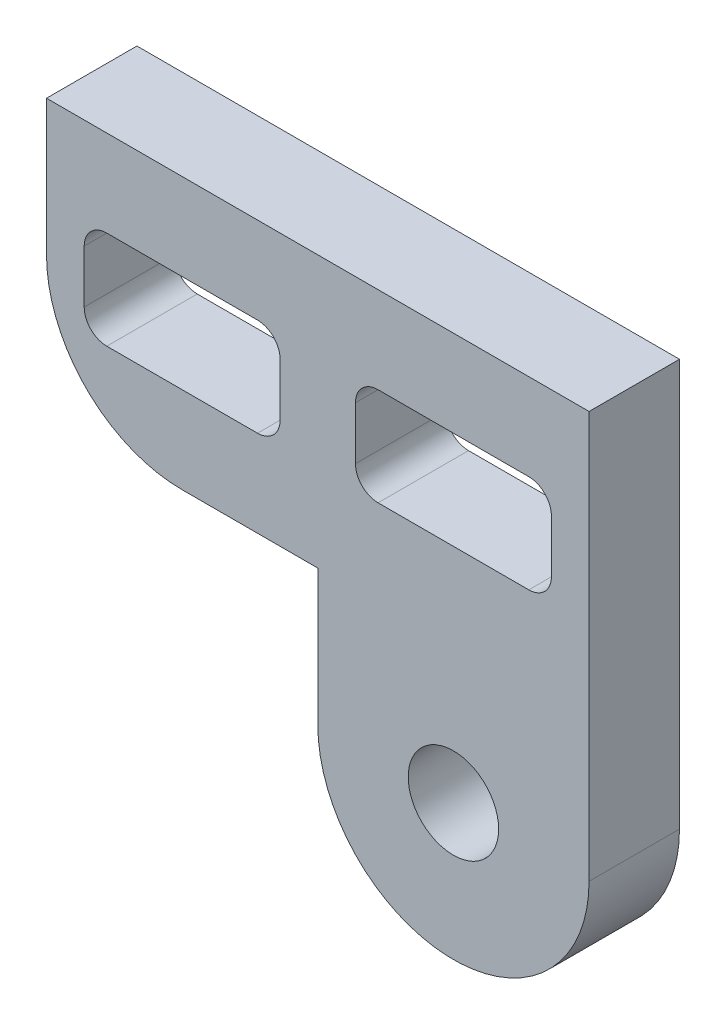
ISO-10303-21;
HEADER;
FILE_DESCRIPTION(('STEP AP214'),'2;1');
FILE_NAME('part.step','',(''),(''),'','','');
FILE_SCHEMA(('AUTOMOTIVE_DESIGN { 1 0 10303 214 1 1 1 1 }'));
ENDSEC;
DATA;
#1=APPLICATION_CONTEXT('core data for automotive mechanical design processes');
#2=APPLICATION_PROTOCOL_DEFINITION('international standard','automotive_design',2000,#1);
#3=PRODUCT_CONTEXT('',#1,'mechanical');
#4=PRODUCT('Part','Part','',(#3));
#5=PRODUCT_RELATED_PRODUCT_CATEGORY('part','',(#4));
#6=PRODUCT_DEFINITION_FORMATION('','',#4);
#7=PRODUCT_DEFINITION_CONTEXT('part definition',#1,'design');
#8=PRODUCT_DEFINITION('design','',#6,#7);
#9=PRODUCT_DEFINITION_SHAPE('','',#8);
#10=(LENGTH_UNIT() NAMED_UNIT(*) SI_UNIT(.MILLI.,.METRE.));
#11=(NAMED_UNIT(*) PLANE_ANGLE_UNIT() SI_UNIT($,.RADIAN.));
#12=(NAMED_UNIT(*) SI_UNIT($,.STERADIAN.) SOLID_ANGLE_UNIT());
#13=UNCERTAINTY_MEASURE_WITH_UNIT(LENGTH_MEASURE(1.E-05),#10,'distance_accuracy_value','');
#14=(GEOMETRIC_REPRESENTATION_CONTEXT(3) GLOBAL_UNCERTAINTY_ASSIGNED_CONTEXT((#13)) GLOBAL_UNIT_ASSIGNED_CONTEXT((#10,
#11,#12)) REPRESENTATION_CONTEXT('',''));
#15=CARTESIAN_POINT('',(0.,0.,0.));
#16=DIRECTION('',(0.,0.,1.));
#17=DIRECTION('',(1.,0.,0.));
#18=AXIS2_PLACEMENT_3D('',#15,#16,#17);
#19=CARTESIAN_POINT('',(149.3421335095,207.323953209,3.));
#20=DIRECTION('',(0.,0.,1.));
#21=DIRECTION('',(1.,0.,0.));
#22=AXIS2_PLACEMENT_3D('',#19,#20,#21);
#23=PLANE('',#22);
#24=DIRECTION('',(1.,0.,0.));
#25=VECTOR('',#24,1.);
#26=CARTESIAN_POINT('',(160.8421335095,205.698953209,3.));
#27=LINE('',#26,#25);
#28=CARTESIAN_POINT('',(155.8421335095,205.698953209,3.));
#29=VERTEX_POINT('',#28);
#30=CARTESIAN_POINT('',(160.8421335095,205.698953209,3.));
#31=VERTEX_POINT('',#30);
#32=EDGE_CURVE('E196',#29,#31,#27,.T.);
#33=ORIENTED_EDGE('',*,*,#32,.F.);
#34=CARTESIAN_POINT('',(155.8421335095,206.448953209,3.));
#35=DIRECTION('',(0.,0.,1.));
#36=DIRECTION('',(1.,0.,0.));
#37=AXIS2_PLACEMENT_3D('',#34,#35,#36);
#38=CIRCLE('',#37,0.749999999999987);
#39=CARTESIAN_POINT('',(155.0921335095,206.448953209,3.));
#40=VERTEX_POINT('',#39);
#41=EDGE_CURVE('E188',#40,#29,#38,.T.);
#42=ORIENTED_EDGE('',*,*,#41,.F.);
#43=DIRECTION('',(0.,-1.,0.));
#44=VECTOR('',#43,1.);
#45=CARTESIAN_POINT('',(155.0921335095,206.448953209,3.));
#46=LINE('',#45,#44);
#47=CARTESIAN_POINT('',(155.0921335095,208.198953209,3.));
#48=VERTEX_POINT('',#47);
#49=EDGE_CURVE('E223',#48,#40,#46,.T.);
#50=ORIENTED_EDGE('',*,*,#49,.F.);
#51=CARTESIAN_POINT('',(155.8421335095,208.198953209,3.));
#52=DIRECTION('',(0.,0.,1.));
#53=DIRECTION('',(1.,0.,0.));
#54=AXIS2_PLACEMENT_3D('',#51,#52,#53);
#55=CIRCLE('',#54,0.749999999999987);
#56=CARTESIAN_POINT('',(155.8421335095,208.948953209,3.));
#57=VERTEX_POINT('',#56);
#58=EDGE_CURVE('E221',#57,#48,#55,.T.);
#59=ORIENTED_EDGE('',*,*,#58,.F.);
#60=DIRECTION('',(-1.,0.,0.));
#61=VECTOR('',#60,1.);
#62=CARTESIAN_POINT('',(155.8421335095,208.948953209,3.));
#63=LINE('',#62,#61);
#64=CARTESIAN_POINT('',(160.8421335095,208.948953209,3.));
#65=VERTEX_POINT('',#64);
#66=EDGE_CURVE('E219',#65,#57,#63,.T.);
#67=ORIENTED_EDGE('',*,*,#66,.F.);
#68=CARTESIAN_POINT('',(160.8421335095,208.198953209,3.));
#69=DIRECTION('',(0.,0.,1.));
#70=DIRECTION('',(1.,0.,0.));
#71=AXIS2_PLACEMENT_3D('',#68,#69,#70);
#72=CIRCLE('',#71,0.750000000000001);
#73=CARTESIAN_POINT('',(161.5921335095,208.198953209,3.));
#74=VERTEX_POINT('',#73);
#75=EDGE_CURVE('E217',#74,#65,#72,.T.);
#76=ORIENTED_EDGE('',*,*,#75,.F.);
#77=DIRECTION('',(0.,1.,0.));
#78=VECTOR('',#77,1.);
#79=CARTESIAN_POINT('',(161.5921335095,208.198953209,3.));
#80=LINE('',#79,#78);
#81=CARTESIAN_POINT('',(161.5921335095,206.448953209,3.));
#82=VERTEX_POINT('',#81);
#83=EDGE_CURVE('E212',#82,#74,#80,.T.);
#84=ORIENTED_EDGE('',*,*,#83,.F.);
#85=CARTESIAN_POINT('',(160.8421335095,206.448953209,3.));
#86=DIRECTION('',(0.,0.,1.));
#87=DIRECTION('',(1.,0.,0.));
#88=AXIS2_PLACEMENT_3D('',#85,#86,#87);
#89=CIRCLE('',#88,0.750000000000001);
#90=EDGE_CURVE('E210',#31,#82,#89,.T.);
#91=ORIENTED_EDGE('',*,*,#90,.F.);
#92=EDGE_LOOP('',(#33,#42,#50,#59,#67,#76,#84,#91));
#93=FACE_BOUND('',#92,.T.);
#94=CARTESIAN_POINT('',(149.3421335095,207.323953209,3.));
#95=DIRECTION('',(0.,0.,1.));
#96=DIRECTION('',(1.,0.,0.));
#97=AXIS2_PLACEMENT_3D('',#94,#95,#96);
#98=CIRCLE('',#97,4.49999999999999);
#99=CARTESIAN_POINT('',(144.8421335095,207.323953209,3.));
#100=VERTEX_POINT('',#99);
#101=CARTESIAN_POINT('',(149.3421335095,202.823953209,3.));
#102=VERTEX_POINT('',#101);
#103=EDGE_CURVE('E315',#100,#102,#98,.T.);
#104=ORIENTED_EDGE('',*,*,#103,.T.);
#105=DIRECTION('',(1.,0.,0.));
#106=VECTOR('',#105,1.);
#107=CARTESIAN_POINT('',(153.8421335095,202.823953209,3.));
#108=LINE('',#107,#106);
#109=CARTESIAN_POINT('',(153.8421335095,202.823953209,3.));
#110=VERTEX_POINT('',#109);
#111=EDGE_CURVE('E318',#102,#110,#108,.T.);
#112=ORIENTED_EDGE('',*,*,#111,.T.);
#113=DIRECTION('',(0.,-1.,0.));
#114=VECTOR('',#113,1.);
#115=CARTESIAN_POINT('',(153.8421335095,198.323953209,3.));
#116=LINE('',#115,#114);
#117=CARTESIAN_POINT('',(153.8421335095,198.323953209,3.));
#118=VERTEX_POINT('',#117);
#119=EDGE_CURVE('E321',#110,#118,#116,.T.);
#120=ORIENTED_EDGE('',*,*,#119,.T.);
#121=CARTESIAN_POINT('',(158.3421335095,198.323953209,3.));
#122=DIRECTION('',(0.,0.,1.));
#123=DIRECTION('',(1.,0.,0.));
#124=AXIS2_PLACEMENT_3D('',#121,#122,#123);
#125=CIRCLE('',#124,4.49999999999999);
#126=CARTESIAN_POINT('',(162.8421335095,198.323953209,3.));
#127=VERTEX_POINT('',#126);
#128=EDGE_CURVE('E323',#118,#127,#125,.T.);
#129=ORIENTED_EDGE('',*,*,#128,.T.);
#130=DIRECTION('',(0.,1.,0.));
#131=VECTOR('',#130,1.);
#132=CARTESIAN_POINT('',(162.8421335095,198.323953209,3.));
#133=LINE('',#132,#131);
#134=CARTESIAN_POINT('',(162.8421335095,211.823953209,3.));
#135=VERTEX_POINT('',#134);
#136=EDGE_CURVE('E325',#127,#135,#133,.T.);
#137=ORIENTED_EDGE('',*,*,#136,.T.);
#138=DIRECTION('',(-1.,0.,0.));
#139=VECTOR('',#138,1.);
#140=CARTESIAN_POINT('',(158.3421335095,211.823953209,3.));
#141=LINE('',#140,#139);
#142=CARTESIAN_POINT('',(144.8421335095,211.823953209,3.));
#143=VERTEX_POINT('',#142);
#144=EDGE_CURVE('E327',#135,#143,#141,.T.);
#145=ORIENTED_EDGE('',*,*,#144,.T.);
#146=DIRECTION('',(0.,-1.,0.));
#147=VECTOR('',#146,1.);
#148=CARTESIAN_POINT('',(144.8421335095,207.323953209,3.));
#149=LINE('',#148,#147);
#150=EDGE_CURVE('E329',#143,#100,#149,.T.);
#151=ORIENTED_EDGE('',*,*,#150,.T.);
#152=EDGE_LOOP('',(#104,#112,#120,#129,#137,#145,#151));
#153=FACE_BOUND('',#152,.T.);
#154=DIRECTION('',(1.,0.,0.));
#155=VECTOR('',#154,1.);
#156=CARTESIAN_POINT('',(151.8421335095,205.698953209,3.));
#157=LINE('',#156,#155);
#158=CARTESIAN_POINT('',(146.8421335095,205.698953209,3.));
#159=VERTEX_POINT('',#158);
#160=CARTESIAN_POINT('',(151.8421335095,205.698953209,3.));
#161=VERTEX_POINT('',#160);
#162=EDGE_CURVE('E258',#159,#161,#157,.T.);
#163=ORIENTED_EDGE('',*,*,#162,.F.);
#164=CARTESIAN_POINT('',(146.8421335095,206.448953209,3.));
#165=DIRECTION('',(0.,0.,1.));
#166=DIRECTION('',(1.,0.,0.));
#167=AXIS2_PLACEMENT_3D('',#164,#165,#166);
#168=CIRCLE('',#167,0.750000000000001);
#169=CARTESIAN_POINT('',(146.0921335095,206.448953209,3.));
#170=VERTEX_POINT('',#169);
#171=EDGE_CURVE('E256',#170,#159,#168,.T.);
#172=ORIENTED_EDGE('',*,*,#171,.F.);
#173=DIRECTION('',(0.,-1.,0.));
#174=VECTOR('',#173,1.);
#175=CARTESIAN_POINT('',(146.0921335095,206.448953209,3.));
#176=LINE('',#175,#174);
#177=CARTESIAN_POINT('',(146.0921335095,208.198953209,3.));
#178=VERTEX_POINT('',#177);
#179=EDGE_CURVE('E272',#178,#170,#176,.T.);
#180=ORIENTED_EDGE('',*,*,#179,.F.);
#181=CARTESIAN_POINT('',(146.8421335095,208.198953209,3.));
#182=DIRECTION('',(0.,0.,1.));
#183=DIRECTION('',(1.,0.,0.));
#184=AXIS2_PLACEMENT_3D('',#181,#182,#183);
#185=CIRCLE('',#184,0.750000000000001);
#186=CARTESIAN_POINT('',(146.8421335095,208.948953209,3.));
#187=VERTEX_POINT('',#186);
#188=EDGE_CURVE('E269',#187,#178,#185,.T.);
#189=ORIENTED_EDGE('',*,*,#188,.F.);
#190=DIRECTION('',(-1.,0.,0.));
#191=VECTOR('',#190,1.);
#192=CARTESIAN_POINT('',(146.8421335095,208.948953209,3.));
#193=LINE('',#192,#191);
#194=CARTESIAN_POINT('',(151.8421335095,208.948953209,3.));
#195=VERTEX_POINT('',#194);
#196=EDGE_CURVE('E267',#195,#187,#193,.T.);
#197=ORIENTED_EDGE('',*,*,#196,.F.);
#198=CARTESIAN_POINT('',(151.8421335095,208.198953209,3.));
#199=DIRECTION('',(0.,0.,1.));
#200=DIRECTION('',(1.,0.,0.));
#201=AXIS2_PLACEMENT_3D('',#198,#199,#200);
#202=CIRCLE('',#201,0.750000000000001);
#203=CARTESIAN_POINT('',(152.5921335095,208.198953209,3.));
#204=VERTEX_POINT('',#203);
#205=EDGE_CURVE('E265',#204,#195,#202,.T.);
#206=ORIENTED_EDGE('',*,*,#205,.F.);
#207=DIRECTION('',(0.,1.,0.));
#208=VECTOR('',#207,1.);
#209=CARTESIAN_POINT('',(152.5921335095,208.198953209,3.));
#210=LINE('',#209,#208);
#211=CARTESIAN_POINT('',(152.5921335095,206.448953209,3.));
#212=VERTEX_POINT('',#211);
#213=EDGE_CURVE('E263',#212,#204,#210,.T.);
#214=ORIENTED_EDGE('',*,*,#213,.F.);
#215=CARTESIAN_POINT('',(151.8421335095,206.448953209,3.));
#216=DIRECTION('',(0.,0.,1.));
#217=DIRECTION('',(1.,0.,0.));
#218=AXIS2_PLACEMENT_3D('',#215,#216,#217);
#219=CIRCLE('',#218,0.750000000000001);
#220=EDGE_CURVE('E261',#161,#212,#219,.T.);
#221=ORIENTED_EDGE('',*,*,#220,.F.);
#222=EDGE_LOOP('',(#163,#172,#180,#189,#197,#206,#214,#221));
#223=FACE_BOUND('',#222,.T.);
#224=CARTESIAN_POINT('',(158.3421335095,198.323953209,3.));
#225=DIRECTION('',(0.,0.,1.));
#226=DIRECTION('',(1.,0.,0.));
#227=AXIS2_PLACEMENT_3D('',#224,#225,#226);
#228=CIRCLE('',#227,1.5);
#229=CARTESIAN_POINT('',(159.8421335095,198.323953209,3.));
#230=VERTEX_POINT('',#229);
#231=EDGE_CURVE('E226',#230,#230,#228,.T.);
#232=ORIENTED_EDGE('',*,*,#231,.F.);
#233=EDGE_LOOP('',(#232));
#234=FACE_BOUND('',#233,.T.);
#235=ADVANCED_FACE('F33',(#93,#153,#223,#234),#23,.T.);
#236=CARTESIAN_POINT('',(149.3421335095,207.323953209,0.));
#237=DIRECTION('',(0.,0.,1.));
#238=DIRECTION('',(1.,0.,0.));
#239=AXIS2_PLACEMENT_3D('',#236,#237,#238);
#240=PLANE('',#239);
#241=CARTESIAN_POINT('',(155.8421335095,206.448953209,0.));
#242=DIRECTION('',(0.,0.,1.));
#243=DIRECTION('',(1.,0.,0.));
#244=AXIS2_PLACEMENT_3D('',#241,#242,#243);
#245=CIRCLE('',#244,0.749999999999987);
#246=CARTESIAN_POINT('',(155.0921335095,206.448953209,0.));
#247=VERTEX_POINT('',#246);
#248=CARTESIAN_POINT('',(155.8421335095,205.698953209,0.));
#249=VERTEX_POINT('',#248);
#250=EDGE_CURVE('E56',#247,#249,#245,.T.);
#251=ORIENTED_EDGE('',*,*,#250,.T.);
#252=DIRECTION('',(1.,0.,0.));
#253=VECTOR('',#252,1.);
#254=CARTESIAN_POINT('',(160.8421335095,205.698953209,0.));
#255=LINE('',#254,#253);
#256=CARTESIAN_POINT('',(160.8421335095,205.698953209,0.));
#257=VERTEX_POINT('',#256);
#258=EDGE_CURVE('E203',#249,#257,#255,.T.);
#259=ORIENTED_EDGE('',*,*,#258,.T.);
#260=CARTESIAN_POINT('',(160.8421335095,206.448953209,0.));
#261=DIRECTION('',(0.,0.,1.));
#262=DIRECTION('',(1.,0.,0.));
#263=AXIS2_PLACEMENT_3D('',#260,#261,#262);
#264=CIRCLE('',#263,0.750000000000001);
#265=CARTESIAN_POINT('',(161.5921335095,206.448953209,0.));
#266=VERTEX_POINT('',#265);
#267=EDGE_CURVE('E228',#257,#266,#264,.T.);
#268=ORIENTED_EDGE('',*,*,#267,.T.);
#269=DIRECTION('',(0.,1.,0.));
#270=VECTOR('',#269,1.);
#271=CARTESIAN_POINT('',(161.5921335095,208.198953209,0.));
#272=LINE('',#271,#270);
#273=CARTESIAN_POINT('',(161.5921335095,208.198953209,0.));
#274=VERTEX_POINT('',#273);
#275=EDGE_CURVE('E231',#266,#274,#272,.T.);
#276=ORIENTED_EDGE('',*,*,#275,.T.);
#277=CARTESIAN_POINT('',(160.8421335095,208.198953209,0.));
#278=DIRECTION('',(0.,0.,1.));
#279=DIRECTION('',(1.,0.,0.));
#280=AXIS2_PLACEMENT_3D('',#277,#278,#279);
#281=CIRCLE('',#280,0.750000000000001);
#282=CARTESIAN_POINT('',(160.8421335095,208.948953209,0.));
#283=VERTEX_POINT('',#282);
#284=EDGE_CURVE('E234',#274,#283,#281,.T.);
#285=ORIENTED_EDGE('',*,*,#284,.T.);
#286=DIRECTION('',(-1.,0.,0.));
#287=VECTOR('',#286,1.);
#288=CARTESIAN_POINT('',(155.8421335095,208.948953209,0.));
#289=LINE('',#288,#287);
#290=CARTESIAN_POINT('',(155.8421335095,208.948953209,0.));
#291=VERTEX_POINT('',#290);
#292=EDGE_CURVE('E237',#283,#291,#289,.T.);
#293=ORIENTED_EDGE('',*,*,#292,.T.);
#294=CARTESIAN_POINT('',(155.8421335095,208.198953209,0.));
#295=DIRECTION('',(0.,0.,1.));
#296=DIRECTION('',(1.,0.,0.));
#297=AXIS2_PLACEMENT_3D('',#294,#295,#296);
#298=CIRCLE('',#297,0.749999999999987);
#299=CARTESIAN_POINT('',(155.0921335095,208.198953209,0.));
#300=VERTEX_POINT('',#299);
#301=EDGE_CURVE('E240',#291,#300,#298,.T.);
#302=ORIENTED_EDGE('',*,*,#301,.T.);
#303=DIRECTION('',(0.,-1.,0.));
#304=VECTOR('',#303,1.);
#305=CARTESIAN_POINT('',(155.0921335095,206.448953209,0.));
#306=LINE('',#305,#304);
#307=EDGE_CURVE('E197',#300,#247,#306,.T.);
#308=ORIENTED_EDGE('',*,*,#307,.T.);
#309=EDGE_LOOP('',(#251,#259,#268,#276,#285,#293,#302,#308));
#310=FACE_BOUND('',#309,.T.);
#311=CARTESIAN_POINT('',(149.3421335095,207.323953209,0.));
#312=DIRECTION('',(0.,0.,1.));
#313=DIRECTION('',(1.,0.,0.));
#314=AXIS2_PLACEMENT_3D('',#311,#312,#313);
#315=CIRCLE('',#314,4.49999999999999);
#316=CARTESIAN_POINT('',(144.8421335095,207.323953209,0.));
#317=VERTEX_POINT('',#316);
#318=CARTESIAN_POINT('',(149.3421335095,202.823953209,0.));
#319=VERTEX_POINT('',#318);
#320=EDGE_CURVE('E314',#317,#319,#315,.T.);
#321=ORIENTED_EDGE('',*,*,#320,.F.);
#322=DIRECTION('',(0.,-1.,0.));
#323=VECTOR('',#322,1.);
#324=CARTESIAN_POINT('',(144.8421335095,207.323953209,0.));
#325=LINE('',#324,#323);
#326=CARTESIAN_POINT('',(144.8421335095,211.823953209,0.));
#327=VERTEX_POINT('',#326);
#328=EDGE_CURVE('E319',#327,#317,#325,.T.);
#329=ORIENTED_EDGE('',*,*,#328,.F.);
#330=DIRECTION('',(-1.,0.,0.));
#331=VECTOR('',#330,1.);
#332=CARTESIAN_POINT('',(149.3421335095,211.823953209,0.));
#333=LINE('',#332,#331);
#334=CARTESIAN_POINT('',(162.8421335095,211.823953209,0.));
#335=VERTEX_POINT('',#334);
#336=EDGE_CURVE('E343',#335,#327,#333,.T.);
#337=ORIENTED_EDGE('',*,*,#336,.F.);
#338=DIRECTION('',(0.,1.,0.));
#339=VECTOR('',#338,1.);
#340=CARTESIAN_POINT('',(162.8421335095,198.323953209,0.));
#341=LINE('',#340,#339);
#342=CARTESIAN_POINT('',(162.8421335095,198.323953209,0.));
#343=VERTEX_POINT('',#342);
#344=EDGE_CURVE('E340',#343,#335,#341,.T.);
#345=ORIENTED_EDGE('',*,*,#344,.F.);
#346=CARTESIAN_POINT('',(158.3421335095,198.323953209,0.));
#347=DIRECTION('',(0.,0.,1.));
#348=DIRECTION('',(1.,0.,0.));
#349=AXIS2_PLACEMENT_3D('',#346,#347,#348);
#350=CIRCLE('',#349,4.49999999999999);
#351=CARTESIAN_POINT('',(153.8421335095,198.323953209,0.));
#352=VERTEX_POINT('',#351);
#353=EDGE_CURVE('E338',#352,#343,#350,.T.);
#354=ORIENTED_EDGE('',*,*,#353,.F.);
#355=DIRECTION('',(0.,-1.,0.));
#356=VECTOR('',#355,1.);
#357=CARTESIAN_POINT('',(153.8421335095,198.323953209,0.));
#358=LINE('',#357,#356);
#359=CARTESIAN_POINT('',(153.8421335095,202.823953209,0.));
#360=VERTEX_POINT('',#359);
#361=EDGE_CURVE('E336',#360,#352,#358,.T.);
#362=ORIENTED_EDGE('',*,*,#361,.F.);
#363=DIRECTION('',(1.,0.,0.));
#364=VECTOR('',#363,1.);
#365=CARTESIAN_POINT('',(153.8421335095,202.823953209,0.));
#366=LINE('',#365,#364);
#367=EDGE_CURVE('E334',#319,#360,#366,.T.);
#368=ORIENTED_EDGE('',*,*,#367,.F.);
#369=EDGE_LOOP('',(#321,#329,#337,#345,#354,#362,#368));
#370=FACE_BOUND('',#369,.T.);
#371=CARTESIAN_POINT('',(146.8421335095,206.448953209,0.));
#372=DIRECTION('',(0.,0.,1.));
#373=DIRECTION('',(1.,0.,0.));
#374=AXIS2_PLACEMENT_3D('',#371,#372,#373);
#375=CIRCLE('',#374,0.750000000000001);
#376=CARTESIAN_POINT('',(146.0921335095,206.448953209,0.));
#377=VERTEX_POINT('',#376);
#378=CARTESIAN_POINT('',(146.8421335095,205.698953209,0.));
#379=VERTEX_POINT('',#378);
#380=EDGE_CURVE('E204',#377,#379,#375,.T.);
#381=ORIENTED_EDGE('',*,*,#380,.T.);
#382=DIRECTION('',(1.,0.,0.));
#383=VECTOR('',#382,1.);
#384=CARTESIAN_POINT('',(151.8421335095,205.698953209,0.));
#385=LINE('',#384,#383);
#386=CARTESIAN_POINT('',(151.8421335095,205.698953209,0.));
#387=VERTEX_POINT('',#386);
#388=EDGE_CURVE('E277',#379,#387,#385,.T.);
#389=ORIENTED_EDGE('',*,*,#388,.T.);
#390=CARTESIAN_POINT('',(151.8421335095,206.448953209,0.));
#391=DIRECTION('',(0.,0.,1.));
#392=DIRECTION('',(1.,0.,0.));
#393=AXIS2_PLACEMENT_3D('',#390,#391,#392);
#394=CIRCLE('',#393,0.750000000000001);
#395=CARTESIAN_POINT('',(152.5921335095,206.448953209,0.));
#396=VERTEX_POINT('',#395);
#397=EDGE_CURVE('E280',#387,#396,#394,.T.);
#398=ORIENTED_EDGE('',*,*,#397,.T.);
#399=DIRECTION('',(0.,1.,0.));
#400=VECTOR('',#399,1.);
#401=CARTESIAN_POINT('',(152.5921335095,208.198953209,0.));
#402=LINE('',#401,#400);
#403=CARTESIAN_POINT('',(152.5921335095,208.198953209,0.));
#404=VERTEX_POINT('',#403);
#405=EDGE_CURVE('E283',#396,#404,#402,.T.);
#406=ORIENTED_EDGE('',*,*,#405,.T.);
#407=CARTESIAN_POINT('',(151.8421335095,208.198953209,0.));
#408=DIRECTION('',(0.,0.,1.));
#409=DIRECTION('',(1.,0.,0.));
#410=AXIS2_PLACEMENT_3D('',#407,#408,#409);
#411=CIRCLE('',#410,0.750000000000001);
#412=CARTESIAN_POINT('',(151.8421335095,208.948953209,0.));
#413=VERTEX_POINT('',#412);
#414=EDGE_CURVE('E286',#404,#413,#411,.T.);
#415=ORIENTED_EDGE('',*,*,#414,.T.);
#416=DIRECTION('',(-1.,0.,0.));
#417=VECTOR('',#416,1.);
#418=CARTESIAN_POINT('',(146.8421335095,208.948953209,0.));
#419=LINE('',#418,#417);
#420=CARTESIAN_POINT('',(146.8421335095,208.948953209,0.));
#421=VERTEX_POINT('',#420);
#422=EDGE_CURVE('E289',#413,#421,#419,.T.);
#423=ORIENTED_EDGE('',*,*,#422,.T.);
#424=CARTESIAN_POINT('',(146.8421335095,208.198953209,0.));
#425=DIRECTION('',(0.,0.,1.));
#426=DIRECTION('',(1.,0.,0.));
#427=AXIS2_PLACEMENT_3D('',#424,#425,#426);
#428=CIRCLE('',#427,0.750000000000001);
#429=CARTESIAN_POINT('',(146.0921335095,208.198953209,0.));
#430=VERTEX_POINT('',#429);
#431=EDGE_CURVE('E292',#421,#430,#428,.T.);
#432=ORIENTED_EDGE('',*,*,#431,.T.);
#433=DIRECTION('',(0.,-1.,0.));
#434=VECTOR('',#433,1.);
#435=CARTESIAN_POINT('',(146.0921335095,206.448953209,0.));
#436=LINE('',#435,#434);
#437=EDGE_CURVE('E259',#430,#377,#436,.T.);
#438=ORIENTED_EDGE('',*,*,#437,.T.);
#439=EDGE_LOOP('',(#381,#389,#398,#406,#415,#423,#432,#438));
#440=FACE_BOUND('',#439,.T.);
#441=CARTESIAN_POINT('',(158.3421335095,198.323953209,0.));
#442=DIRECTION('',(0.,0.,1.));
#443=DIRECTION('',(1.,0.,0.));
#444=AXIS2_PLACEMENT_3D('',#441,#442,#443);
#445=CIRCLE('',#444,1.5);
#446=CARTESIAN_POINT('',(159.8421335095,198.323953209,0.));
#447=VERTEX_POINT('',#446);
#448=EDGE_CURVE('E480',#447,#447,#445,.T.);
#449=ORIENTED_EDGE('',*,*,#448,.T.);
#450=EDGE_LOOP('',(#449));
#451=FACE_BOUND('',#450,.T.);
#452=ADVANCED_FACE('F370',(#310,#370,#440,#451),#240,.F.);
#453=CARTESIAN_POINT('',(149.3421335095,207.323953209,3.));
#454=DIRECTION('',(0.,0.,-1.));
#455=DIRECTION('',(-1.,0.,0.));
#456=AXIS2_PLACEMENT_3D('',#453,#454,#455);
#457=CYLINDRICAL_SURFACE('',#456,4.49999999999999);
#458=ORIENTED_EDGE('',*,*,#320,.T.);
#459=DIRECTION('',(0.,0.,-1.));
#460=VECTOR('',#459,1.);
#461=CARTESIAN_POINT('',(149.3421335095,202.823953209,3.));
#462=LINE('',#461,#460);
#463=EDGE_CURVE('E11',#102,#319,#462,.T.);
#464=ORIENTED_EDGE('',*,*,#463,.F.);
#465=ORIENTED_EDGE('',*,*,#103,.F.);
#466=DIRECTION('',(0.,0.,-1.));
#467=VECTOR('',#466,1.);
#468=CARTESIAN_POINT('',(144.8421335095,207.323953209,3.));
#469=LINE('',#468,#467);
#470=EDGE_CURVE('E331',#100,#317,#469,.T.);
#471=ORIENTED_EDGE('',*,*,#470,.T.);
#472=EDGE_LOOP('',(#458,#464,#465,#471));
#473=FACE_BOUND('',#472,.T.);
#474=ADVANCED_FACE('F35',(#473),#457,.T.);
#475=CARTESIAN_POINT('',(153.8421335095,202.823953209,3.));
#476=DIRECTION('',(0.,1.,0.));
#477=DIRECTION('',(0.,0.,1.));
#478=AXIS2_PLACEMENT_3D('',#475,#476,#477);
#479=PLANE('',#478);
#480=ORIENTED_EDGE('',*,*,#367,.T.);
#481=DIRECTION('',(0.,0.,-1.));
#482=VECTOR('',#481,1.);
#483=CARTESIAN_POINT('',(153.8421335095,202.823953209,3.));
#484=LINE('',#483,#482);
#485=EDGE_CURVE('E41',#110,#360,#484,.T.);
#486=ORIENTED_EDGE('',*,*,#485,.F.);
#487=ORIENTED_EDGE('',*,*,#111,.F.);
#488=ORIENTED_EDGE('',*,*,#463,.T.);
#489=EDGE_LOOP('',(#480,#486,#487,#488));
#490=FACE_BOUND('',#489,.T.);
#491=ADVANCED_FACE('F386',(#490),#479,.F.);
#492=CARTESIAN_POINT('',(153.8421335095,198.323953209,3.));
#493=DIRECTION('',(1.,0.,0.));
#494=DIRECTION('',(0.,0.,-1.));
#495=AXIS2_PLACEMENT_3D('',#492,#493,#494);
#496=PLANE('',#495);
#497=ORIENTED_EDGE('',*,*,#361,.T.);
#498=DIRECTION('',(0.,0.,-1.));
#499=VECTOR('',#498,1.);
#500=CARTESIAN_POINT('',(153.8421335095,198.323953209,3.));
#501=LINE('',#500,#499);
#502=EDGE_CURVE('E357',#118,#352,#501,.T.);
#503=ORIENTED_EDGE('',*,*,#502,.F.);
#504=ORIENTED_EDGE('',*,*,#119,.F.);
#505=ORIENTED_EDGE('',*,*,#485,.T.);
#506=EDGE_LOOP('',(#497,#503,#504,#505));
#507=FACE_BOUND('',#506,.T.);
#508=ADVANCED_FACE('F364',(#507),#496,.F.);
#509=CARTESIAN_POINT('',(158.3421335095,198.323953209,3.));
#510=DIRECTION('',(0.,0.,-1.));
#511=DIRECTION('',(-1.,0.,0.));
#512=AXIS2_PLACEMENT_3D('',#509,#510,#511);
#513=CYLINDRICAL_SURFACE('',#512,4.49999999999999);
#514=ORIENTED_EDGE('',*,*,#353,.T.);
#515=DIRECTION('',(0.,0.,-1.));
#516=VECTOR('',#515,1.);
#517=CARTESIAN_POINT('',(162.8421335095,198.323953209,3.));
#518=LINE('',#517,#516);
#519=EDGE_CURVE('E354',#127,#343,#518,.T.);
#520=ORIENTED_EDGE('',*,*,#519,.F.);
#521=ORIENTED_EDGE('',*,*,#128,.F.);
#522=ORIENTED_EDGE('',*,*,#502,.T.);
#523=EDGE_LOOP('',(#514,#520,#521,#522));
#524=FACE_BOUND('',#523,.T.);
#525=ADVANCED_FACE('F375',(#524),#513,.T.);
#526=CARTESIAN_POINT('',(162.8421335095,198.323953209,3.));
#527=DIRECTION('',(-1.,0.,0.));
#528=DIRECTION('',(0.,0.,1.));
#529=AXIS2_PLACEMENT_3D('',#526,#527,#528);
#530=PLANE('',#529);
#531=ORIENTED_EDGE('',*,*,#344,.T.);
#532=DIRECTION('',(0.,0.,-1.));
#533=VECTOR('',#532,1.);
#534=CARTESIAN_POINT('',(162.8421335095,211.823953209,3.));
#535=LINE('',#534,#533);
#536=EDGE_CURVE('E351',#135,#335,#535,.T.);
#537=ORIENTED_EDGE('',*,*,#536,.F.);
#538=ORIENTED_EDGE('',*,*,#136,.F.);
#539=ORIENTED_EDGE('',*,*,#519,.T.);
#540=EDGE_LOOP('',(#531,#537,#538,#539));
#541=FACE_BOUND('',#540,.T.);
#542=ADVANCED_FACE('F379',(#541),#530,.F.);
#543=CARTESIAN_POINT('',(149.3421335095,211.823953209,3.));
#544=DIRECTION('',(0.,-1.,0.));
#545=DIRECTION('',(0.,0.,-1.));
#546=AXIS2_PLACEMENT_3D('',#543,#544,#545);
#547=PLANE('',#546);
#548=ORIENTED_EDGE('',*,*,#336,.T.);
#549=DIRECTION('',(0.,0.,-1.));
#550=VECTOR('',#549,1.);
#551=CARTESIAN_POINT('',(144.8421335095,211.823953209,3.));
#552=LINE('',#551,#550);
#553=EDGE_CURVE('E348',#143,#327,#552,.T.);
#554=ORIENTED_EDGE('',*,*,#553,.F.);
#555=ORIENTED_EDGE('',*,*,#144,.F.);
#556=ORIENTED_EDGE('',*,*,#536,.T.);
#557=EDGE_LOOP('',(#548,#554,#555,#556));
#558=FACE_BOUND('',#557,.T.);
#559=ADVANCED_FACE('F394',(#558),#547,.F.);
#560=CARTESIAN_POINT('',(144.8421335095,207.323953209,3.));
#561=DIRECTION('',(1.,0.,0.));
#562=DIRECTION('',(0.,0.,-1.));
#563=AXIS2_PLACEMENT_3D('',#560,#561,#562);
#564=PLANE('',#563);
#565=ORIENTED_EDGE('',*,*,#328,.T.);
#566=ORIENTED_EDGE('',*,*,#470,.F.);
#567=ORIENTED_EDGE('',*,*,#150,.F.);
#568=ORIENTED_EDGE('',*,*,#553,.T.);
#569=EDGE_LOOP('',(#565,#566,#567,#568));
#570=FACE_BOUND('',#569,.T.);
#571=ADVANCED_FACE('F391',(#570),#564,.F.);
#572=CARTESIAN_POINT('',(146.8421335095,206.448953209,3.));
#573=DIRECTION('',(0.,0.,-1.));
#574=DIRECTION('',(-1.,0.,0.));
#575=AXIS2_PLACEMENT_3D('',#572,#573,#574);
#576=CYLINDRICAL_SURFACE('',#575,0.750000000000001);
#577=ORIENTED_EDGE('',*,*,#380,.F.);
#578=DIRECTION('',(0.,0.,-1.));
#579=VECTOR('',#578,1.);
#580=CARTESIAN_POINT('',(146.0921335095,206.448953209,3.));
#581=LINE('',#580,#579);
#582=EDGE_CURVE('E274',#170,#377,#581,.T.);
#583=ORIENTED_EDGE('',*,*,#582,.F.);
#584=ORIENTED_EDGE('',*,*,#171,.T.);
#585=DIRECTION('',(0.,0.,-1.));
#586=VECTOR('',#585,1.);
#587=CARTESIAN_POINT('',(146.8421335095,205.698953209,3.));
#588=LINE('',#587,#586);
#589=EDGE_CURVE('E311',#159,#379,#588,.T.);
#590=ORIENTED_EDGE('',*,*,#589,.T.);
#591=EDGE_LOOP('',(#577,#583,#584,#590));
#592=FACE_BOUND('',#591,.T.);
#593=ADVANCED_FACE('F401',(#592),#576,.F.);
#594=CARTESIAN_POINT('',(151.8421335095,205.698953209,3.));
#595=DIRECTION('',(0.,1.,0.));
#596=DIRECTION('',(0.,0.,1.));
#597=AXIS2_PLACEMENT_3D('',#594,#595,#596);
#598=PLANE('',#597);
#599=ORIENTED_EDGE('',*,*,#388,.F.);
#600=ORIENTED_EDGE('',*,*,#589,.F.);
#601=ORIENTED_EDGE('',*,*,#162,.T.);
#602=DIRECTION('',(0.,0.,-1.));
#603=VECTOR('',#602,1.);
#604=CARTESIAN_POINT('',(151.8421335095,205.698953209,3.));
#605=LINE('',#604,#603);
#606=EDGE_CURVE('E309',#161,#387,#605,.T.);
#607=ORIENTED_EDGE('',*,*,#606,.T.);
#608=EDGE_LOOP('',(#599,#600,#601,#607));
#609=FACE_BOUND('',#608,.T.);
#610=ADVANCED_FACE('F414',(#609),#598,.T.);
#611=CARTESIAN_POINT('',(151.8421335095,206.448953209,3.));
#612=DIRECTION('',(0.,0.,-1.));
#613=DIRECTION('',(-1.,0.,0.));
#614=AXIS2_PLACEMENT_3D('',#611,#612,#613);
#615=CYLINDRICAL_SURFACE('',#614,0.750000000000001);
#616=ORIENTED_EDGE('',*,*,#397,.F.);
#617=ORIENTED_EDGE('',*,*,#606,.F.);
#618=ORIENTED_EDGE('',*,*,#220,.T.);
#619=DIRECTION('',(0.,0.,-1.));
#620=VECTOR('',#619,1.);
#621=CARTESIAN_POINT('',(152.5921335095,206.448953209,3.));
#622=LINE('',#621,#620);
#623=EDGE_CURVE('E307',#212,#396,#622,.T.);
#624=ORIENTED_EDGE('',*,*,#623,.T.);
#625=EDGE_LOOP('',(#616,#617,#618,#624));
#626=FACE_BOUND('',#625,.T.);
#627=ADVANCED_FACE('F418',(#626),#615,.F.);
#628=CARTESIAN_POINT('',(152.5921335095,208.198953209,3.));
#629=DIRECTION('',(-1.,0.,0.));
#630=DIRECTION('',(0.,0.,1.));
#631=AXIS2_PLACEMENT_3D('',#628,#629,#630);
#632=PLANE('',#631);
#633=ORIENTED_EDGE('',*,*,#405,.F.);
#634=ORIENTED_EDGE('',*,*,#623,.F.);
#635=ORIENTED_EDGE('',*,*,#213,.T.);
#636=DIRECTION('',(0.,0.,-1.));
#637=VECTOR('',#636,1.);
#638=CARTESIAN_POINT('',(152.5921335095,208.198953209,3.));
#639=LINE('',#638,#637);
#640=EDGE_CURVE('E305',#204,#404,#639,.T.);
#641=ORIENTED_EDGE('',*,*,#640,.T.);
#642=EDGE_LOOP('',(#633,#634,#635,#641));
#643=FACE_BOUND('',#642,.T.);
#644=ADVANCED_FACE('F422',(#643),#632,.T.);
#645=CARTESIAN_POINT('',(151.8421335095,208.198953209,3.));
#646=DIRECTION('',(0.,0.,-1.));
#647=DIRECTION('',(-1.,0.,0.));
#648=AXIS2_PLACEMENT_3D('',#645,#646,#647);
#649=CYLINDRICAL_SURFACE('',#648,0.750000000000001);
#650=ORIENTED_EDGE('',*,*,#414,.F.);
#651=ORIENTED_EDGE('',*,*,#640,.F.);
#652=ORIENTED_EDGE('',*,*,#205,.T.);
#653=DIRECTION('',(0.,0.,-1.));
#654=VECTOR('',#653,1.);
#655=CARTESIAN_POINT('',(151.8421335095,208.948953209,3.));
#656=LINE('',#655,#654);
#657=EDGE_CURVE('E303',#195,#413,#656,.T.);
#658=ORIENTED_EDGE('',*,*,#657,.T.);
#659=EDGE_LOOP('',(#650,#651,#652,#658));
#660=FACE_BOUND('',#659,.T.);
#661=ADVANCED_FACE('F426',(#660),#649,.F.);
#662=CARTESIAN_POINT('',(146.8421335095,208.948953209,3.));
#663=DIRECTION('',(0.,-1.,0.));
#664=DIRECTION('',(0.,0.,-1.));
#665=AXIS2_PLACEMENT_3D('',#662,#663,#664);
#666=PLANE('',#665);
#667=ORIENTED_EDGE('',*,*,#422,.F.);
#668=ORIENTED_EDGE('',*,*,#657,.F.);
#669=ORIENTED_EDGE('',*,*,#196,.T.);
#670=DIRECTION('',(0.,0.,-1.));
#671=VECTOR('',#670,1.);
#672=CARTESIAN_POINT('',(146.8421335095,208.948953209,3.));
#673=LINE('',#672,#671);
#674=EDGE_CURVE('E301',#187,#421,#673,.T.);
#675=ORIENTED_EDGE('',*,*,#674,.T.);
#676=EDGE_LOOP('',(#667,#668,#669,#675));
#677=FACE_BOUND('',#676,.T.);
#678=ADVANCED_FACE('F430',(#677),#666,.T.);
#679=CARTESIAN_POINT('',(146.8421335095,208.198953209,3.));
#680=DIRECTION('',(0.,0.,-1.));
#681=DIRECTION('',(-1.,0.,0.));
#682=AXIS2_PLACEMENT_3D('',#679,#680,#681);
#683=CYLINDRICAL_SURFACE('',#682,0.750000000000001);
#684=ORIENTED_EDGE('',*,*,#431,.F.);
#685=ORIENTED_EDGE('',*,*,#674,.F.);
#686=ORIENTED_EDGE('',*,*,#188,.T.);
#687=DIRECTION('',(0.,0.,-1.));
#688=VECTOR('',#687,1.);
#689=CARTESIAN_POINT('',(146.0921335095,208.198953209,3.));
#690=LINE('',#689,#688);
#691=EDGE_CURVE('E299',#178,#430,#690,.T.);
#692=ORIENTED_EDGE('',*,*,#691,.T.);
#693=EDGE_LOOP('',(#684,#685,#686,#692));
#694=FACE_BOUND('',#693,.T.);
#695=ADVANCED_FACE('F434',(#694),#683,.F.);
#696=CARTESIAN_POINT('',(146.0921335095,206.448953209,3.));
#697=DIRECTION('',(1.,0.,0.));
#698=DIRECTION('',(0.,0.,-1.));
#699=AXIS2_PLACEMENT_3D('',#696,#697,#698);
#700=PLANE('',#699);
#701=ORIENTED_EDGE('',*,*,#437,.F.);
#702=ORIENTED_EDGE('',*,*,#691,.F.);
#703=ORIENTED_EDGE('',*,*,#179,.T.);
#704=ORIENTED_EDGE('',*,*,#582,.T.);
#705=EDGE_LOOP('',(#701,#702,#703,#704));
#706=FACE_BOUND('',#705,.T.);
#707=ADVANCED_FACE('F438',(#706),#700,.T.);
#708=CARTESIAN_POINT('',(155.8421335095,206.448953209,3.));
#709=DIRECTION('',(0.,0.,-1.));
#710=DIRECTION('',(-1.,0.,0.));
#711=AXIS2_PLACEMENT_3D('',#708,#709,#710);
#712=CYLINDRICAL_SURFACE('',#711,0.749999999999987);
#713=ORIENTED_EDGE('',*,*,#250,.F.);
#714=DIRECTION('',(0.,0.,-1.));
#715=VECTOR('',#714,1.);
#716=CARTESIAN_POINT('',(155.0921335095,206.448953209,3.));
#717=LINE('',#716,#715);
#718=EDGE_CURVE('E192',#40,#247,#717,.T.);
#719=ORIENTED_EDGE('',*,*,#718,.F.);
#720=ORIENTED_EDGE('',*,*,#41,.T.);
#721=DIRECTION('',(0.,0.,-1.));
#722=VECTOR('',#721,1.);
#723=CARTESIAN_POINT('',(155.8421335095,205.698953209,3.));
#724=LINE('',#723,#722);
#725=EDGE_CURVE('E191',#29,#249,#724,.T.);
#726=ORIENTED_EDGE('',*,*,#725,.T.);
#727=EDGE_LOOP('',(#713,#719,#720,#726));
#728=FACE_BOUND('',#727,.T.);
#729=ADVANCED_FACE('F190',(#728),#712,.F.);
#730=CARTESIAN_POINT('',(160.8421335095,205.698953209,3.));
#731=DIRECTION('',(0.,1.,0.));
#732=DIRECTION('',(0.,0.,1.));
#733=AXIS2_PLACEMENT_3D('',#730,#731,#732);
#734=PLANE('',#733);
#735=ORIENTED_EDGE('',*,*,#258,.F.);
#736=ORIENTED_EDGE('',*,*,#725,.F.);
#737=ORIENTED_EDGE('',*,*,#32,.T.);
#738=DIRECTION('',(0.,0.,-1.));
#739=VECTOR('',#738,1.);
#740=CARTESIAN_POINT('',(160.8421335095,205.698953209,3.));
#741=LINE('',#740,#739);
#742=EDGE_CURVE('E205',#31,#257,#741,.T.);
#743=ORIENTED_EDGE('',*,*,#742,.T.);
#744=EDGE_LOOP('',(#735,#736,#737,#743));
#745=FACE_BOUND('',#744,.T.);
#746=ADVANCED_FACE('F200',(#745),#734,.T.);
#747=CARTESIAN_POINT('',(160.8421335095,206.448953209,3.));
#748=DIRECTION('',(0.,0.,-1.));
#749=DIRECTION('',(-1.,0.,0.));
#750=AXIS2_PLACEMENT_3D('',#747,#748,#749);
#751=CYLINDRICAL_SURFACE('',#750,0.750000000000001);
#752=ORIENTED_EDGE('',*,*,#267,.F.);
#753=ORIENTED_EDGE('',*,*,#742,.F.);
#754=ORIENTED_EDGE('',*,*,#90,.T.);
#755=DIRECTION('',(0.,0.,-1.));
#756=VECTOR('',#755,1.);
#757=CARTESIAN_POINT('',(161.5921335095,206.448953209,3.));
#758=LINE('',#757,#756);
#759=EDGE_CURVE('E253',#82,#266,#758,.T.);
#760=ORIENTED_EDGE('',*,*,#759,.T.);
#761=EDGE_LOOP('',(#752,#753,#754,#760));
#762=FACE_BOUND('',#761,.T.);
#763=ADVANCED_FACE('F447',(#762),#751,.F.);
#764=CARTESIAN_POINT('',(161.5921335095,208.198953209,3.));
#765=DIRECTION('',(-1.,0.,0.));
#766=DIRECTION('',(0.,0.,1.));
#767=AXIS2_PLACEMENT_3D('',#764,#765,#766);
#768=PLANE('',#767);
#769=ORIENTED_EDGE('',*,*,#275,.F.);
#770=ORIENTED_EDGE('',*,*,#759,.F.);
#771=ORIENTED_EDGE('',*,*,#83,.T.);
#772=DIRECTION('',(0.,0.,-1.));
#773=VECTOR('',#772,1.);
#774=CARTESIAN_POINT('',(161.5921335095,208.198953209,3.));
#775=LINE('',#774,#773);
#776=EDGE_CURVE('E251',#74,#274,#775,.T.);
#777=ORIENTED_EDGE('',*,*,#776,.T.);
#778=EDGE_LOOP('',(#769,#770,#771,#777));
#779=FACE_BOUND('',#778,.T.);
#780=ADVANCED_FACE('F450',(#779),#768,.T.);
#781=CARTESIAN_POINT('',(160.8421335095,208.198953209,3.));
#782=DIRECTION('',(0.,0.,-1.));
#783=DIRECTION('',(-1.,0.,0.));
#784=AXIS2_PLACEMENT_3D('',#781,#782,#783);
#785=CYLINDRICAL_SURFACE('',#784,0.750000000000001);
#786=ORIENTED_EDGE('',*,*,#284,.F.);
#787=ORIENTED_EDGE('',*,*,#776,.F.);
#788=ORIENTED_EDGE('',*,*,#75,.T.);
#789=DIRECTION('',(0.,0.,-1.));
#790=VECTOR('',#789,1.);
#791=CARTESIAN_POINT('',(160.8421335095,208.948953209,3.));
#792=LINE('',#791,#790);
#793=EDGE_CURVE('E249',#65,#283,#792,.T.);
#794=ORIENTED_EDGE('',*,*,#793,.T.);
#795=EDGE_LOOP('',(#786,#787,#788,#794));
#796=FACE_BOUND('',#795,.T.);
#797=ADVANCED_FACE('F454',(#796),#785,.F.);
#798=CARTESIAN_POINT('',(155.8421335095,208.948953209,3.));
#799=DIRECTION('',(0.,-1.,0.));
#800=DIRECTION('',(0.,0.,-1.));
#801=AXIS2_PLACEMENT_3D('',#798,#799,#800);
#802=PLANE('',#801);
#803=ORIENTED_EDGE('',*,*,#292,.F.);
#804=ORIENTED_EDGE('',*,*,#793,.F.);
#805=ORIENTED_EDGE('',*,*,#66,.T.);
#806=DIRECTION('',(0.,0.,-1.));
#807=VECTOR('',#806,1.);
#808=CARTESIAN_POINT('',(155.8421335095,208.948953209,3.));
#809=LINE('',#808,#807);
#810=EDGE_CURVE('E247',#57,#291,#809,.T.);
#811=ORIENTED_EDGE('',*,*,#810,.T.);
#812=EDGE_LOOP('',(#803,#804,#805,#811));
#813=FACE_BOUND('',#812,.T.);
#814=ADVANCED_FACE('F458',(#813),#802,.T.);
#815=CARTESIAN_POINT('',(155.8421335095,208.198953209,3.));
#816=DIRECTION('',(0.,0.,-1.));
#817=DIRECTION('',(-1.,0.,0.));
#818=AXIS2_PLACEMENT_3D('',#815,#816,#817);
#819=CYLINDRICAL_SURFACE('',#818,0.749999999999987);
#820=ORIENTED_EDGE('',*,*,#301,.F.);
#821=ORIENTED_EDGE('',*,*,#810,.F.);
#822=ORIENTED_EDGE('',*,*,#58,.T.);
#823=DIRECTION('',(0.,0.,-1.));
#824=VECTOR('',#823,1.);
#825=CARTESIAN_POINT('',(155.0921335095,208.198953209,3.));
#826=LINE('',#825,#824);
#827=EDGE_CURVE('E48',#48,#300,#826,.T.);
#828=ORIENTED_EDGE('',*,*,#827,.T.);
#829=EDGE_LOOP('',(#820,#821,#822,#828));
#830=FACE_BOUND('',#829,.T.);
#831=ADVANCED_FACE('F462',(#830),#819,.F.);
#832=CARTESIAN_POINT('',(155.0921335095,206.448953209,3.));
#833=DIRECTION('',(1.,0.,0.));
#834=DIRECTION('',(0.,0.,-1.));
#835=AXIS2_PLACEMENT_3D('',#832,#833,#834);
#836=PLANE('',#835);
#837=ORIENTED_EDGE('',*,*,#307,.F.);
#838=ORIENTED_EDGE('',*,*,#827,.F.);
#839=ORIENTED_EDGE('',*,*,#49,.T.);
#840=ORIENTED_EDGE('',*,*,#718,.T.);
#841=EDGE_LOOP('',(#837,#838,#839,#840));
#842=FACE_BOUND('',#841,.T.);
#843=ADVANCED_FACE('F466',(#842),#836,.T.);
#844=CARTESIAN_POINT('',(158.3421335095,198.323953209,3.));
#845=DIRECTION('',(0.,0.,-1.));
#846=DIRECTION('',(-1.,0.,0.));
#847=AXIS2_PLACEMENT_3D('',#844,#845,#846);
#848=CYLINDRICAL_SURFACE('',#847,1.5);
#849=ORIENTED_EDGE('',*,*,#231,.T.);
#850=EDGE_LOOP('',(#849));
#851=FACE_BOUND('',#850,.T.);
#852=ORIENTED_EDGE('',*,*,#448,.F.);
#853=EDGE_LOOP('',(#852));
#854=FACE_BOUND('',#853,.T.);
#855=ADVANCED_FACE('F470',(#851,#854),#848,.F.);
#856=CLOSED_SHELL('',(#235,#452,#474,#491,#508,#525,#542,#559,#571,#593,#610,#627,#644,#661,
#678,#695,#707,#729,#746,#763,#780,#797,#814,#831,#843,#855));
#857=MANIFOLD_SOLID_BREP('B2',#856);
#858=ADVANCED_BREP_SHAPE_REPRESENTATION('',(#18,#857),#14);
#859=SHAPE_DEFINITION_REPRESENTATION(#9,#858);
ENDSEC;
END-ISO-10303-21;
